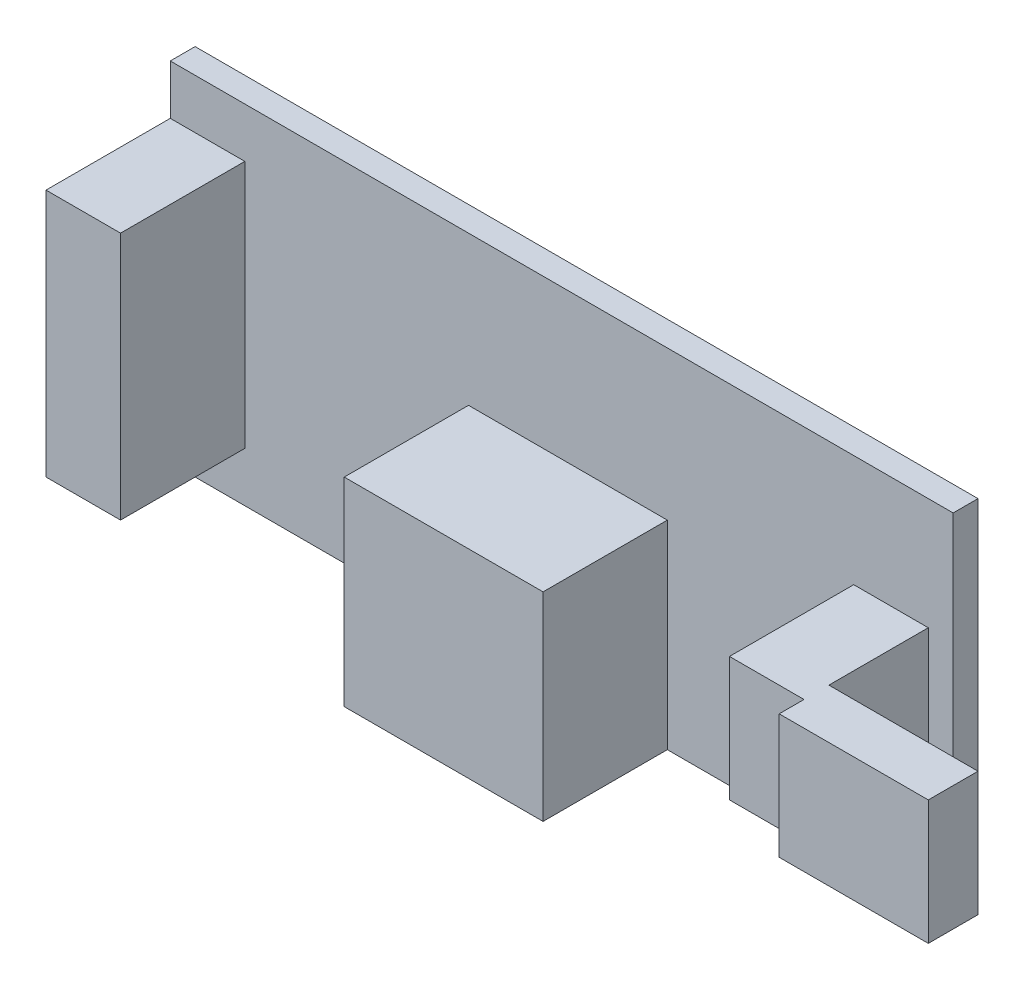
ISO-10303-21;
HEADER;
FILE_DESCRIPTION(('STEP AP214'),'2;1');
FILE_NAME('part.step','',(''),(''),'','','');
FILE_SCHEMA(('AUTOMOTIVE_DESIGN { 1 0 10303 214 1 1 1 1 }'));
ENDSEC;
DATA;
#1=APPLICATION_CONTEXT('core data for automotive mechanical design processes');
#2=APPLICATION_PROTOCOL_DEFINITION('international standard','automotive_design',2000,#1);
#3=PRODUCT_CONTEXT('',#1,'mechanical');
#4=PRODUCT('Part','Part','',(#3));
#5=PRODUCT_RELATED_PRODUCT_CATEGORY('part','',(#4));
#6=PRODUCT_DEFINITION_FORMATION('','',#4);
#7=PRODUCT_DEFINITION_CONTEXT('part definition',#1,'design');
#8=PRODUCT_DEFINITION('design','',#6,#7);
#9=PRODUCT_DEFINITION_SHAPE('','',#8);
#10=(LENGTH_UNIT() NAMED_UNIT(*) SI_UNIT(.MILLI.,.METRE.));
#11=(NAMED_UNIT(*) PLANE_ANGLE_UNIT() SI_UNIT($,.RADIAN.));
#12=(NAMED_UNIT(*) SI_UNIT($,.STERADIAN.) SOLID_ANGLE_UNIT());
#13=UNCERTAINTY_MEASURE_WITH_UNIT(LENGTH_MEASURE(1.E-05),#10,'distance_accuracy_value','');
#14=(GEOMETRIC_REPRESENTATION_CONTEXT(3) GLOBAL_UNCERTAINTY_ASSIGNED_CONTEXT((#13)) GLOBAL_UNIT_ASSIGNED_CONTEXT((#10,
#11,#12)) REPRESENTATION_CONTEXT('',''));
#15=CARTESIAN_POINT('',(0.,0.,0.));
#16=DIRECTION('',(0.,0.,1.));
#17=DIRECTION('',(1.,0.,0.));
#18=AXIS2_PLACEMENT_3D('',#15,#16,#17);
#19=CARTESIAN_POINT('',(11.3241573874395,3.58828005831901,5.));
#20=DIRECTION('',(-1.,0.,0.));
#21=DIRECTION('',(0.,-1.,0.));
#22=AXIS2_PLACEMENT_3D('',#19,#20,#21);
#23=PLANE('',#22);
#24=DIRECTION('',(0.,1.,0.));
#25=VECTOR('',#24,1.);
#26=CARTESIAN_POINT('',(11.3241573874395,3.58828005831901,4.));
#27=LINE('',#26,#25);
#28=CARTESIAN_POINT('',(11.3241573874395,-1.41171994168099,4.));
#29=VERTEX_POINT('',#28);
#30=CARTESIAN_POINT('',(11.3241573874395,3.58828005831901,4.));
#31=VERTEX_POINT('',#30);
#32=EDGE_CURVE('E201',#29,#31,#27,.T.);
#33=ORIENTED_EDGE('',*,*,#32,.F.);
#34=DIRECTION('',(0.,0.,-1.));
#35=VECTOR('',#34,1.);
#36=CARTESIAN_POINT('',(11.3241573874395,-1.41171994168099,5.));
#37=LINE('',#36,#35);
#38=CARTESIAN_POINT('',(11.3241573874395,-1.41171994168099,0.));
#39=VERTEX_POINT('',#38);
#40=EDGE_CURVE('E283',#29,#39,#37,.T.);
#41=ORIENTED_EDGE('',*,*,#40,.T.);
#42=DIRECTION('',(0.,1.,0.));
#43=VECTOR('',#42,1.);
#44=CARTESIAN_POINT('',(11.3241573874395,3.58828005831901,0.));
#45=LINE('',#44,#43);
#46=CARTESIAN_POINT('',(11.3241573874395,3.58828005831901,0.));
#47=VERTEX_POINT('',#46);
#48=EDGE_CURVE('E271',#39,#47,#45,.T.);
#49=ORIENTED_EDGE('',*,*,#48,.T.);
#50=DIRECTION('',(0.,0.,-1.));
#51=VECTOR('',#50,1.);
#52=CARTESIAN_POINT('',(11.3241573874395,3.58828005831901,5.));
#53=LINE('',#52,#51);
#54=EDGE_CURVE('E280',#31,#47,#53,.T.);
#55=ORIENTED_EDGE('',*,*,#54,.F.);
#56=EDGE_LOOP('',(#33,#41,#49,#55));
#57=FACE_BOUND('',#56,.T.);
#58=ADVANCED_FACE('F39',(#57),#23,.F.);
#59=CARTESIAN_POINT('',(0.,0.,0.));
#60=DIRECTION('',(0.,0.,1.));
#61=DIRECTION('',(1.,0.,0.));
#62=AXIS2_PLACEMENT_3D('',#59,#60,#61);
#63=PLANE('',#62);
#64=DIRECTION('',(1.,0.,0.));
#65=VECTOR('',#64,1.);
#66=CARTESIAN_POINT('',(8.32415738743947,-1.41171994168099,0.));
#67=LINE('',#66,#65);
#68=CARTESIAN_POINT('',(8.32415738743947,-1.41171994168099,0.));
#69=VERTEX_POINT('',#68);
#70=EDGE_CURVE('E267',#69,#39,#67,.T.);
#71=ORIENTED_EDGE('',*,*,#70,.F.);
#72=DIRECTION('',(0.,-1.,0.));
#73=VECTOR('',#72,1.);
#74=CARTESIAN_POINT('',(8.32415738743947,3.58828005831901,0.));
#75=LINE('',#74,#73);
#76=CARTESIAN_POINT('',(8.32415738743947,3.58828005831901,0.));
#77=VERTEX_POINT('',#76);
#78=EDGE_CURVE('E246',#77,#69,#75,.T.);
#79=ORIENTED_EDGE('',*,*,#78,.F.);
#80=DIRECTION('',(-1.,0.,0.));
#81=VECTOR('',#80,1.);
#82=CARTESIAN_POINT('',(8.32415738743947,3.58828005831901,0.));
#83=LINE('',#82,#81);
#84=EDGE_CURVE('E252',#47,#77,#83,.T.);
#85=ORIENTED_EDGE('',*,*,#84,.F.);
#86=ORIENTED_EDGE('',*,*,#48,.F.);
#87=EDGE_LOOP('',(#71,#79,#85,#86));
#88=FACE_BOUND('',#87,.T.);
#89=DIRECTION('',(0.,1.,0.));
#90=VECTOR('',#89,1.);
#91=CARTESIAN_POINT('',(-16.1758426125605,6.08828005831901,0.));
#92=LINE('',#91,#90);
#93=CARTESIAN_POINT('',(-16.1758426125605,-3.91171994168099,0.));
#94=VERTEX_POINT('',#93);
#95=CARTESIAN_POINT('',(-16.1758426125605,6.08828005831901,0.));
#96=VERTEX_POINT('',#95);
#97=EDGE_CURVE('E57',#94,#96,#92,.T.);
#98=ORIENTED_EDGE('',*,*,#97,.F.);
#99=DIRECTION('',(1.,0.,0.));
#100=VECTOR('',#99,1.);
#101=CARTESIAN_POINT('',(-19.1758426125605,-3.91171994168099,0.));
#102=LINE('',#101,#100);
#103=CARTESIAN_POINT('',(-19.1758426125605,-3.91171994168099,0.));
#104=VERTEX_POINT('',#103);
#105=EDGE_CURVE('E204',#104,#94,#102,.T.);
#106=ORIENTED_EDGE('',*,*,#105,.F.);
#107=DIRECTION('',(0.,-1.,0.));
#108=VECTOR('',#107,1.);
#109=CARTESIAN_POINT('',(-19.1758426125605,8.08828005831901,0.));
#110=LINE('',#109,#108);
#111=CARTESIAN_POINT('',(-19.1758426125605,-5.91171994168099,0.));
#112=VERTEX_POINT('',#111);
#113=EDGE_CURVE('E330',#104,#112,#110,.T.);
#114=ORIENTED_EDGE('',*,*,#113,.T.);
#115=DIRECTION('',(1.,0.,0.));
#116=VECTOR('',#115,1.);
#117=CARTESIAN_POINT('',(-19.1758426125605,-5.91171994168099,0.));
#118=LINE('',#117,#116);
#119=CARTESIAN_POINT('',(-7.17584261256053,-5.91171994168099,0.));
#120=VERTEX_POINT('',#119);
#121=EDGE_CURVE('E352',#112,#120,#118,.T.);
#122=ORIENTED_EDGE('',*,*,#121,.T.);
#123=DIRECTION('',(0.,-1.,0.));
#124=VECTOR('',#123,1.);
#125=CARTESIAN_POINT('',(-7.17584261256053,2.08828005831901,0.));
#126=LINE('',#125,#124);
#127=CARTESIAN_POINT('',(-7.17584261256053,2.08828005831901,0.));
#128=VERTEX_POINT('',#127);
#129=EDGE_CURVE('E289',#128,#120,#126,.T.);
#130=ORIENTED_EDGE('',*,*,#129,.F.);
#131=DIRECTION('',(-1.,0.,0.));
#132=VECTOR('',#131,1.);
#133=CARTESIAN_POINT('',(-7.17584261256053,2.08828005831901,0.));
#134=LINE('',#133,#132);
#135=CARTESIAN_POINT('',(0.824157387439472,2.08828005831901,0.));
#136=VERTEX_POINT('',#135);
#137=EDGE_CURVE('E295',#136,#128,#134,.T.);
#138=ORIENTED_EDGE('',*,*,#137,.F.);
#139=DIRECTION('',(0.,1.,0.));
#140=VECTOR('',#139,1.);
#141=CARTESIAN_POINT('',(0.824157387439472,2.08828005831901,0.));
#142=LINE('',#141,#140);
#143=CARTESIAN_POINT('',(0.824157387439472,-5.91171994168099,0.));
#144=VERTEX_POINT('',#143);
#145=EDGE_CURVE('E308',#144,#136,#142,.T.);
#146=ORIENTED_EDGE('',*,*,#145,.F.);
#147=CARTESIAN_POINT('',(12.3241573874395,-5.91171994168099,0.));
#148=VERTEX_POINT('',#147);
#149=EDGE_CURVE('E351',#144,#148,#118,.T.);
#150=ORIENTED_EDGE('',*,*,#149,.T.);
#151=DIRECTION('',(0.,1.,0.));
#152=VECTOR('',#151,1.);
#153=CARTESIAN_POINT('',(12.3241573874395,8.08828005831901,0.));
#154=LINE('',#153,#152);
#155=CARTESIAN_POINT('',(12.3241573874395,8.08828005831901,0.));
#156=VERTEX_POINT('',#155);
#157=EDGE_CURVE('E355',#148,#156,#154,.T.);
#158=ORIENTED_EDGE('',*,*,#157,.T.);
#159=DIRECTION('',(-1.,0.,0.));
#160=VECTOR('',#159,1.);
#161=CARTESIAN_POINT('',(-19.1758426125605,8.08828005831901,0.));
#162=LINE('',#161,#160);
#163=CARTESIAN_POINT('',(-19.1758426125605,8.08828005831901,0.));
#164=VERTEX_POINT('',#163);
#165=EDGE_CURVE('E336',#156,#164,#162,.T.);
#166=ORIENTED_EDGE('',*,*,#165,.T.);
#167=CARTESIAN_POINT('',(-19.1758426125605,6.08828005831901,0.));
#168=VERTEX_POINT('',#167);
#169=EDGE_CURVE('E348',#164,#168,#110,.T.);
#170=ORIENTED_EDGE('',*,*,#169,.T.);
#171=DIRECTION('',(-1.,0.,0.));
#172=VECTOR('',#171,1.);
#173=CARTESIAN_POINT('',(-19.1758426125605,6.08828005831901,0.));
#174=LINE('',#173,#172);
#175=EDGE_CURVE('E62',#96,#168,#174,.T.);
#176=ORIENTED_EDGE('',*,*,#175,.F.);
#177=EDGE_LOOP('',(#98,#106,#114,#122,#130,#138,#146,#150,#158,#166,#170,#176));
#178=FACE_BOUND('',#177,.T.);
#179=ADVANCED_FACE('F379',(#88,#178),#63,.T.);
#180=CARTESIAN_POINT('',(-19.1758426125605,8.08828005831901,-1.));
#181=DIRECTION('',(-1.,0.,0.));
#182=DIRECTION('',(0.,0.,1.));
#183=AXIS2_PLACEMENT_3D('',#180,#181,#182);
#184=PLANE('',#183);
#185=ORIENTED_EDGE('',*,*,#169,.F.);
#186=DIRECTION('',(0.,0.,1.));
#187=VECTOR('',#186,1.);
#188=CARTESIAN_POINT('',(-19.1758426125605,8.08828005831901,-1.));
#189=LINE('',#188,#187);
#190=CARTESIAN_POINT('',(-19.1758426125605,8.08828005831901,-1.));
#191=VERTEX_POINT('',#190);
#192=EDGE_CURVE('E11',#191,#164,#189,.T.);
#193=ORIENTED_EDGE('',*,*,#192,.F.);
#194=DIRECTION('',(0.,-1.,0.));
#195=VECTOR('',#194,1.);
#196=CARTESIAN_POINT('',(-19.1758426125605,8.08828005831901,-1.));
#197=LINE('',#196,#195);
#198=CARTESIAN_POINT('',(-19.1758426125605,-5.91171994168099,-1.));
#199=VERTEX_POINT('',#198);
#200=EDGE_CURVE('E331',#191,#199,#197,.T.);
#201=ORIENTED_EDGE('',*,*,#200,.T.);
#202=DIRECTION('',(0.,0.,1.));
#203=VECTOR('',#202,1.);
#204=CARTESIAN_POINT('',(-19.1758426125605,-5.91171994168099,-1.));
#205=LINE('',#204,#203);
#206=EDGE_CURVE('E43',#199,#112,#205,.T.);
#207=ORIENTED_EDGE('',*,*,#206,.T.);
#208=ORIENTED_EDGE('',*,*,#113,.F.);
#209=DIRECTION('',(0.,0.,-1.));
#210=VECTOR('',#209,1.);
#211=CARTESIAN_POINT('',(-19.1758426125605,-3.91171994168099,5.));
#212=LINE('',#211,#210);
#213=CARTESIAN_POINT('',(-19.1758426125605,-3.91171994168099,5.));
#214=VERTEX_POINT('',#213);
#215=EDGE_CURVE('E242',#214,#104,#212,.T.);
#216=ORIENTED_EDGE('',*,*,#215,.F.);
#217=DIRECTION('',(0.,-1.,0.));
#218=VECTOR('',#217,1.);
#219=CARTESIAN_POINT('',(-19.1758426125605,6.08828005831901,5.));
#220=LINE('',#219,#218);
#221=CARTESIAN_POINT('',(-19.1758426125605,6.08828005831901,5.));
#222=VERTEX_POINT('',#221);
#223=EDGE_CURVE('E213',#222,#214,#220,.T.);
#224=ORIENTED_EDGE('',*,*,#223,.F.);
#225=DIRECTION('',(0.,0.,-1.));
#226=VECTOR('',#225,1.);
#227=CARTESIAN_POINT('',(-19.1758426125605,6.08828005831901,5.));
#228=LINE('',#227,#226);
#229=EDGE_CURVE('E225',#222,#168,#228,.T.);
#230=ORIENTED_EDGE('',*,*,#229,.T.);
#231=EDGE_LOOP('',(#185,#193,#201,#207,#208,#216,#224,#230));
#232=FACE_BOUND('',#231,.T.);
#233=ADVANCED_FACE('F41',(#232),#184,.T.);
#234=CARTESIAN_POINT('',(-19.1758426125605,8.08828005831901,-1.));
#235=DIRECTION('',(0.,1.,0.));
#236=DIRECTION('',(0.,0.,1.));
#237=AXIS2_PLACEMENT_3D('',#234,#235,#236);
#238=PLANE('',#237);
#239=ORIENTED_EDGE('',*,*,#165,.F.);
#240=DIRECTION('',(0.,0.,1.));
#241=VECTOR('',#240,1.);
#242=CARTESIAN_POINT('',(12.3241573874395,8.08828005831901,-1.));
#243=LINE('',#242,#241);
#244=CARTESIAN_POINT('',(12.3241573874395,8.08828005831901,-1.));
#245=VERTEX_POINT('',#244);
#246=EDGE_CURVE('E49',#245,#156,#243,.T.);
#247=ORIENTED_EDGE('',*,*,#246,.F.);
#248=DIRECTION('',(-1.,0.,0.));
#249=VECTOR('',#248,1.);
#250=CARTESIAN_POINT('',(-19.1758426125605,8.08828005831901,-1.));
#251=LINE('',#250,#249);
#252=EDGE_CURVE('E344',#245,#191,#251,.T.);
#253=ORIENTED_EDGE('',*,*,#252,.T.);
#254=ORIENTED_EDGE('',*,*,#192,.T.);
#255=EDGE_LOOP('',(#239,#247,#253,#254));
#256=FACE_BOUND('',#255,.T.);
#257=ADVANCED_FACE('F536',(#256),#238,.T.);
#258=CARTESIAN_POINT('',(12.3241573874395,8.08828005831901,-1.));
#259=DIRECTION('',(1.,0.,0.));
#260=DIRECTION('',(0.,0.,-1.));
#261=AXIS2_PLACEMENT_3D('',#258,#259,#260);
#262=PLANE('',#261);
#263=ORIENTED_EDGE('',*,*,#157,.F.);
#264=DIRECTION('',(0.,0.,1.));
#265=VECTOR('',#264,1.);
#266=CARTESIAN_POINT('',(12.3241573874395,-5.91171994168099,-1.));
#267=LINE('',#266,#265);
#268=CARTESIAN_POINT('',(12.3241573874395,-5.91171994168099,-1.));
#269=VERTEX_POINT('',#268);
#270=EDGE_CURVE('E363',#269,#148,#267,.T.);
#271=ORIENTED_EDGE('',*,*,#270,.F.);
#272=DIRECTION('',(0.,1.,0.));
#273=VECTOR('',#272,1.);
#274=CARTESIAN_POINT('',(12.3241573874395,8.08828005831901,-1.));
#275=LINE('',#274,#273);
#276=EDGE_CURVE('E340',#269,#245,#275,.T.);
#277=ORIENTED_EDGE('',*,*,#276,.T.);
#278=ORIENTED_EDGE('',*,*,#246,.T.);
#279=EDGE_LOOP('',(#263,#271,#277,#278));
#280=FACE_BOUND('',#279,.T.);
#281=ADVANCED_FACE('F583',(#280),#262,.T.);
#282=CARTESIAN_POINT('',(-19.1758426125605,-5.91171994168099,-1.));
#283=DIRECTION('',(0.,-1.,0.));
#284=DIRECTION('',(0.,0.,-1.));
#285=AXIS2_PLACEMENT_3D('',#282,#283,#284);
#286=PLANE('',#285);
#287=ORIENTED_EDGE('',*,*,#121,.F.);
#288=ORIENTED_EDGE('',*,*,#206,.F.);
#289=DIRECTION('',(1.,0.,0.));
#290=VECTOR('',#289,1.);
#291=CARTESIAN_POINT('',(-19.1758426125605,-5.91171994168099,-1.));
#292=LINE('',#291,#290);
#293=EDGE_CURVE('E335',#199,#269,#292,.T.);
#294=ORIENTED_EDGE('',*,*,#293,.T.);
#295=ORIENTED_EDGE('',*,*,#270,.T.);
#296=ORIENTED_EDGE('',*,*,#149,.F.);
#297=DIRECTION('',(0.,0.,-1.));
#298=VECTOR('',#297,1.);
#299=CARTESIAN_POINT('',(0.824157387439474,-5.91171994168099,5.));
#300=LINE('',#299,#298);
#301=CARTESIAN_POINT('',(0.824157387439474,-5.91171994168099,5.));
#302=VERTEX_POINT('',#301);
#303=EDGE_CURVE('E322',#302,#144,#300,.T.);
#304=ORIENTED_EDGE('',*,*,#303,.F.);
#305=DIRECTION('',(1.,0.,0.));
#306=VECTOR('',#305,1.);
#307=CARTESIAN_POINT('',(-7.17584261256053,-5.91171994168099,5.));
#308=LINE('',#307,#306);
#309=CARTESIAN_POINT('',(-7.17584261256053,-5.91171994168099,5.));
#310=VERTEX_POINT('',#309);
#311=EDGE_CURVE('E294',#310,#302,#308,.T.);
#312=ORIENTED_EDGE('',*,*,#311,.F.);
#313=DIRECTION('',(0.,0.,-1.));
#314=VECTOR('',#313,1.);
#315=CARTESIAN_POINT('',(-7.17584261256053,-5.91171994168099,5.));
#316=LINE('',#315,#314);
#317=EDGE_CURVE('E326',#310,#120,#316,.T.);
#318=ORIENTED_EDGE('',*,*,#317,.T.);
#319=EDGE_LOOP('',(#287,#288,#294,#295,#296,#304,#312,#318));
#320=FACE_BOUND('',#319,.T.);
#321=ADVANCED_FACE('F377',(#320),#286,.T.);
#322=CARTESIAN_POINT('',(0.,0.,-1.));
#323=DIRECTION('',(0.,0.,1.));
#324=DIRECTION('',(1.,0.,0.));
#325=AXIS2_PLACEMENT_3D('',#322,#323,#324);
#326=PLANE('',#325);
#327=ORIENTED_EDGE('',*,*,#200,.F.);
#328=ORIENTED_EDGE('',*,*,#252,.F.);
#329=ORIENTED_EDGE('',*,*,#276,.F.);
#330=ORIENTED_EDGE('',*,*,#293,.F.);
#331=EDGE_LOOP('',(#327,#328,#329,#330));
#332=FACE_BOUND('',#331,.T.);
#333=ADVANCED_FACE('F573',(#332),#326,.F.);
#334=CARTESIAN_POINT('',(-7.17584261256053,2.08828005831901,5.));
#335=DIRECTION('',(1.,0.,0.));
#336=DIRECTION('',(0.,1.,0.));
#337=AXIS2_PLACEMENT_3D('',#334,#335,#336);
#338=PLANE('',#337);
#339=ORIENTED_EDGE('',*,*,#129,.T.);
#340=ORIENTED_EDGE('',*,*,#317,.F.);
#341=DIRECTION('',(0.,-1.,0.));
#342=VECTOR('',#341,1.);
#343=CARTESIAN_POINT('',(-7.17584261256053,2.08828005831901,5.));
#344=LINE('',#343,#342);
#345=CARTESIAN_POINT('',(-7.17584261256053,2.08828005831901,5.));
#346=VERTEX_POINT('',#345);
#347=EDGE_CURVE('E290',#346,#310,#344,.T.);
#348=ORIENTED_EDGE('',*,*,#347,.F.);
#349=DIRECTION('',(0.,0.,-1.));
#350=VECTOR('',#349,1.);
#351=CARTESIAN_POINT('',(-7.17584261256053,2.08828005831901,5.));
#352=LINE('',#351,#350);
#353=EDGE_CURVE('E304',#346,#128,#352,.T.);
#354=ORIENTED_EDGE('',*,*,#353,.T.);
#355=EDGE_LOOP('',(#339,#340,#348,#354));
#356=FACE_BOUND('',#355,.T.);
#357=ADVANCED_FACE('F394',(#356),#338,.F.);
#358=CARTESIAN_POINT('',(0.824157387439472,2.08828005831901,5.));
#359=DIRECTION('',(-1.,0.,0.));
#360=DIRECTION('',(0.,-1.,0.));
#361=AXIS2_PLACEMENT_3D('',#358,#359,#360);
#362=PLANE('',#361);
#363=ORIENTED_EDGE('',*,*,#145,.T.);
#364=DIRECTION('',(0.,0.,-1.));
#365=VECTOR('',#364,1.);
#366=CARTESIAN_POINT('',(0.824157387439472,2.08828005831901,5.));
#367=LINE('',#366,#365);
#368=CARTESIAN_POINT('',(0.824157387439472,2.08828005831901,5.));
#369=VERTEX_POINT('',#368);
#370=EDGE_CURVE('E318',#369,#136,#367,.T.);
#371=ORIENTED_EDGE('',*,*,#370,.F.);
#372=DIRECTION('',(0.,1.,0.));
#373=VECTOR('',#372,1.);
#374=CARTESIAN_POINT('',(0.824157387439472,2.08828005831901,5.));
#375=LINE('',#374,#373);
#376=EDGE_CURVE('E298',#302,#369,#375,.T.);
#377=ORIENTED_EDGE('',*,*,#376,.F.);
#378=ORIENTED_EDGE('',*,*,#303,.T.);
#379=EDGE_LOOP('',(#363,#371,#377,#378));
#380=FACE_BOUND('',#379,.T.);
#381=ADVANCED_FACE('F386',(#380),#362,.F.);
#382=CARTESIAN_POINT('',(-7.17584261256053,2.08828005831901,5.));
#383=DIRECTION('',(0.,-1.,0.));
#384=DIRECTION('',(0.,0.,-1.));
#385=AXIS2_PLACEMENT_3D('',#382,#383,#384);
#386=PLANE('',#385);
#387=ORIENTED_EDGE('',*,*,#137,.T.);
#388=ORIENTED_EDGE('',*,*,#353,.F.);
#389=DIRECTION('',(-1.,0.,0.));
#390=VECTOR('',#389,1.);
#391=CARTESIAN_POINT('',(-7.17584261256053,2.08828005831901,5.));
#392=LINE('',#391,#390);
#393=EDGE_CURVE('E301',#369,#346,#392,.T.);
#394=ORIENTED_EDGE('',*,*,#393,.F.);
#395=ORIENTED_EDGE('',*,*,#370,.T.);
#396=EDGE_LOOP('',(#387,#388,#394,#395));
#397=FACE_BOUND('',#396,.T.);
#398=ADVANCED_FACE('F396',(#397),#386,.F.);
#399=CARTESIAN_POINT('',(0.,0.,5.));
#400=DIRECTION('',(0.,0.,1.));
#401=DIRECTION('',(1.,0.,0.));
#402=AXIS2_PLACEMENT_3D('',#399,#400,#401);
#403=PLANE('',#402);
#404=ORIENTED_EDGE('',*,*,#347,.T.);
#405=ORIENTED_EDGE('',*,*,#311,.T.);
#406=ORIENTED_EDGE('',*,*,#376,.T.);
#407=ORIENTED_EDGE('',*,*,#393,.T.);
#408=EDGE_LOOP('',(#404,#405,#406,#407));
#409=FACE_BOUND('',#408,.T.);
#410=ADVANCED_FACE('F390',(#409),#403,.T.);
#411=CARTESIAN_POINT('',(8.32415738743947,3.58828005831901,5.));
#412=DIRECTION('',(1.,0.,0.));
#413=DIRECTION('',(0.,0.,-1.));
#414=AXIS2_PLACEMENT_3D('',#411,#412,#413);
#415=PLANE('',#414);
#416=ORIENTED_EDGE('',*,*,#78,.T.);
#417=DIRECTION('',(0.,0.,-1.));
#418=VECTOR('',#417,1.);
#419=CARTESIAN_POINT('',(8.32415738743947,-1.41171994168099,5.));
#420=LINE('',#419,#418);
#421=CARTESIAN_POINT('',(8.32415738743947,-1.41171994168099,5.));
#422=VERTEX_POINT('',#421);
#423=EDGE_CURVE('E286',#422,#69,#420,.T.);
#424=ORIENTED_EDGE('',*,*,#423,.F.);
#425=DIRECTION('',(0.,-1.,0.));
#426=VECTOR('',#425,1.);
#427=CARTESIAN_POINT('',(8.32415738743947,3.58828005831901,5.));
#428=LINE('',#427,#426);
#429=CARTESIAN_POINT('',(8.32415738743947,3.58828005831901,5.));
#430=VERTEX_POINT('',#429);
#431=EDGE_CURVE('E247',#430,#422,#428,.T.);
#432=ORIENTED_EDGE('',*,*,#431,.F.);
#433=DIRECTION('',(0.,0.,-1.));
#434=VECTOR('',#433,1.);
#435=CARTESIAN_POINT('',(8.32415738743947,3.58828005831901,5.));
#436=LINE('',#435,#434);
#437=EDGE_CURVE('E263',#430,#77,#436,.T.);
#438=ORIENTED_EDGE('',*,*,#437,.T.);
#439=EDGE_LOOP('',(#416,#424,#432,#438));
#440=FACE_BOUND('',#439,.T.);
#441=ADVANCED_FACE('F403',(#440),#415,.F.);
#442=CARTESIAN_POINT('',(8.32415738743947,-1.41171994168099,5.));
#443=DIRECTION('',(0.,1.,0.));
#444=DIRECTION('',(-1.,0.,0.));
#445=AXIS2_PLACEMENT_3D('',#442,#443,#444);
#446=PLANE('',#445);
#447=ORIENTED_EDGE('',*,*,#70,.T.);
#448=ORIENTED_EDGE('',*,*,#40,.F.);
#449=DIRECTION('',(-1.,0.,0.));
#450=VECTOR('',#449,1.);
#451=CARTESIAN_POINT('',(17.3241573874395,-1.41171994168099,4.));
#452=LINE('',#451,#450);
#453=CARTESIAN_POINT('',(17.3241573874395,-1.41171994168099,4.));
#454=VERTEX_POINT('',#453);
#455=EDGE_CURVE('E452',#454,#29,#452,.T.);
#456=ORIENTED_EDGE('',*,*,#455,.F.);
#457=DIRECTION('',(0.,0.,-1.));
#458=VECTOR('',#457,1.);
#459=CARTESIAN_POINT('',(17.3241573874395,-1.41171994168099,4.));
#460=LINE('',#459,#458);
#461=CARTESIAN_POINT('',(17.3241573874395,-1.41171994168099,6.));
#462=VERTEX_POINT('',#461);
#463=EDGE_CURVE('E193',#462,#454,#460,.T.);
#464=ORIENTED_EDGE('',*,*,#463,.F.);
#465=DIRECTION('',(-1.,0.,0.));
#466=VECTOR('',#465,1.);
#467=CARTESIAN_POINT('',(17.3241573874395,-1.41171994168099,6.));
#468=LINE('',#467,#466);
#469=CARTESIAN_POINT('',(11.3241573874395,-1.41171994168099,6.));
#470=VERTEX_POINT('',#469);
#471=EDGE_CURVE('E209',#462,#470,#468,.T.);
#472=ORIENTED_EDGE('',*,*,#471,.T.);
#473=DIRECTION('',(0.,0.,-1.));
#474=VECTOR('',#473,1.);
#475=CARTESIAN_POINT('',(11.3241573874395,-1.41171994168099,4.));
#476=LINE('',#475,#474);
#477=CARTESIAN_POINT('',(11.3241573874395,-1.41171994168099,5.));
#478=VERTEX_POINT('',#477);
#479=EDGE_CURVE('E197',#470,#478,#476,.T.);
#480=ORIENTED_EDGE('',*,*,#479,.T.);
#481=DIRECTION('',(1.,0.,0.));
#482=VECTOR('',#481,1.);
#483=CARTESIAN_POINT('',(8.32415738743947,-1.41171994168099,5.));
#484=LINE('',#483,#482);
#485=EDGE_CURVE('E251',#422,#478,#484,.T.);
#486=ORIENTED_EDGE('',*,*,#485,.F.);
#487=ORIENTED_EDGE('',*,*,#423,.T.);
#488=EDGE_LOOP('',(#447,#448,#456,#464,#472,#480,#486,#487));
#489=FACE_BOUND('',#488,.T.);
#490=ADVANCED_FACE('F417',(#489),#446,.F.);
#491=CARTESIAN_POINT('',(8.32415738743947,3.58828005831901,5.));
#492=DIRECTION('',(0.,-1.,0.));
#493=DIRECTION('',(1.,0.,0.));
#494=AXIS2_PLACEMENT_3D('',#491,#492,#493);
#495=PLANE('',#494);
#496=ORIENTED_EDGE('',*,*,#84,.T.);
#497=ORIENTED_EDGE('',*,*,#437,.F.);
#498=DIRECTION('',(-1.,0.,0.));
#499=VECTOR('',#498,1.);
#500=CARTESIAN_POINT('',(8.32415738743947,3.58828005831901,5.));
#501=LINE('',#500,#499);
#502=CARTESIAN_POINT('',(11.3241573874395,3.58828005831901,5.));
#503=VERTEX_POINT('',#502);
#504=EDGE_CURVE('E260',#503,#430,#501,.T.);
#505=ORIENTED_EDGE('',*,*,#504,.F.);
#506=DIRECTION('',(0.,0.,1.));
#507=VECTOR('',#506,1.);
#508=CARTESIAN_POINT('',(11.3241573874395,3.58828005831901,4.));
#509=LINE('',#508,#507);
#510=CARTESIAN_POINT('',(11.3241573874395,3.58828005831901,6.));
#511=VERTEX_POINT('',#510);
#512=EDGE_CURVE('E440',#503,#511,#509,.T.);
#513=ORIENTED_EDGE('',*,*,#512,.T.);
#514=DIRECTION('',(-1.,0.,0.));
#515=VECTOR('',#514,1.);
#516=CARTESIAN_POINT('',(17.3241573874395,3.58828005831901,6.));
#517=LINE('',#516,#515);
#518=CARTESIAN_POINT('',(17.3241573874395,3.58828005831901,6.));
#519=VERTEX_POINT('',#518);
#520=EDGE_CURVE('E183',#519,#511,#517,.T.);
#521=ORIENTED_EDGE('',*,*,#520,.F.);
#522=DIRECTION('',(0.,0.,1.));
#523=VECTOR('',#522,1.);
#524=CARTESIAN_POINT('',(17.3241573874395,3.58828005831901,4.));
#525=LINE('',#524,#523);
#526=CARTESIAN_POINT('',(17.3241573874395,3.58828005831901,4.));
#527=VERTEX_POINT('',#526);
#528=EDGE_CURVE('E176',#527,#519,#525,.T.);
#529=ORIENTED_EDGE('',*,*,#528,.F.);
#530=DIRECTION('',(-1.,0.,0.));
#531=VECTOR('',#530,1.);
#532=CARTESIAN_POINT('',(17.3241573874395,3.58828005831901,4.));
#533=LINE('',#532,#531);
#534=EDGE_CURVE('E180',#527,#31,#533,.T.);
#535=ORIENTED_EDGE('',*,*,#534,.T.);
#536=ORIENTED_EDGE('',*,*,#54,.T.);
#537=EDGE_LOOP('',(#496,#497,#505,#513,#521,#529,#535,#536));
#538=FACE_BOUND('',#537,.T.);
#539=ADVANCED_FACE('F178',(#538),#495,.F.);
#540=CARTESIAN_POINT('',(0.,0.,5.));
#541=DIRECTION('',(0.,0.,1.));
#542=DIRECTION('',(1.,0.,0.));
#543=AXIS2_PLACEMENT_3D('',#540,#541,#542);
#544=PLANE('',#543);
#545=ORIENTED_EDGE('',*,*,#431,.T.);
#546=ORIENTED_EDGE('',*,*,#485,.T.);
#547=DIRECTION('',(0.,1.,0.));
#548=VECTOR('',#547,1.);
#549=CARTESIAN_POINT('',(11.3241573874395,3.58828005831901,5.));
#550=LINE('',#549,#548);
#551=EDGE_CURVE('E256',#478,#503,#550,.T.);
#552=ORIENTED_EDGE('',*,*,#551,.T.);
#553=ORIENTED_EDGE('',*,*,#504,.T.);
#554=EDGE_LOOP('',(#545,#546,#552,#553));
#555=FACE_BOUND('',#554,.T.);
#556=ADVANCED_FACE('F437',(#555),#544,.T.);
#557=CARTESIAN_POINT('',(-19.1758426125605,-3.91171994168099,5.));
#558=DIRECTION('',(0.,1.,0.));
#559=DIRECTION('',(0.,0.,1.));
#560=AXIS2_PLACEMENT_3D('',#557,#558,#559);
#561=PLANE('',#560);
#562=ORIENTED_EDGE('',*,*,#105,.T.);
#563=DIRECTION('',(0.,0.,-1.));
#564=VECTOR('',#563,1.);
#565=CARTESIAN_POINT('',(-16.1758426125605,-3.91171994168099,5.));
#566=LINE('',#565,#564);
#567=CARTESIAN_POINT('',(-16.1758426125605,-3.91171994168099,5.));
#568=VERTEX_POINT('',#567);
#569=EDGE_CURVE('E238',#568,#94,#566,.T.);
#570=ORIENTED_EDGE('',*,*,#569,.F.);
#571=DIRECTION('',(1.,0.,0.));
#572=VECTOR('',#571,1.);
#573=CARTESIAN_POINT('',(-19.1758426125605,-3.91171994168099,5.));
#574=LINE('',#573,#572);
#575=EDGE_CURVE('E217',#214,#568,#574,.T.);
#576=ORIENTED_EDGE('',*,*,#575,.F.);
#577=ORIENTED_EDGE('',*,*,#215,.T.);
#578=EDGE_LOOP('',(#562,#570,#576,#577));
#579=FACE_BOUND('',#578,.T.);
#580=ADVANCED_FACE('F484',(#579),#561,.F.);
#581=CARTESIAN_POINT('',(-16.1758426125605,6.08828005831901,5.));
#582=DIRECTION('',(-1.,0.,0.));
#583=DIRECTION('',(0.,0.,1.));
#584=AXIS2_PLACEMENT_3D('',#581,#582,#583);
#585=PLANE('',#584);
#586=ORIENTED_EDGE('',*,*,#97,.T.);
#587=DIRECTION('',(0.,0.,-1.));
#588=VECTOR('',#587,1.);
#589=CARTESIAN_POINT('',(-16.1758426125605,6.08828005831901,5.));
#590=LINE('',#589,#588);
#591=CARTESIAN_POINT('',(-16.1758426125605,6.08828005831901,5.));
#592=VERTEX_POINT('',#591);
#593=EDGE_CURVE('E234',#592,#96,#590,.T.);
#594=ORIENTED_EDGE('',*,*,#593,.F.);
#595=DIRECTION('',(0.,1.,0.));
#596=VECTOR('',#595,1.);
#597=CARTESIAN_POINT('',(-16.1758426125605,6.08828005831901,5.));
#598=LINE('',#597,#596);
#599=EDGE_CURVE('E220',#568,#592,#598,.T.);
#600=ORIENTED_EDGE('',*,*,#599,.F.);
#601=ORIENTED_EDGE('',*,*,#569,.T.);
#602=EDGE_LOOP('',(#586,#594,#600,#601));
#603=FACE_BOUND('',#602,.T.);
#604=ADVANCED_FACE('F480',(#603),#585,.F.);
#605=CARTESIAN_POINT('',(-19.1758426125605,6.08828005831901,5.));
#606=DIRECTION('',(0.,-1.,0.));
#607=DIRECTION('',(0.,0.,-1.));
#608=AXIS2_PLACEMENT_3D('',#605,#606,#607);
#609=PLANE('',#608);
#610=ORIENTED_EDGE('',*,*,#175,.T.);
#611=ORIENTED_EDGE('',*,*,#229,.F.);
#612=DIRECTION('',(-1.,0.,0.));
#613=VECTOR('',#612,1.);
#614=CARTESIAN_POINT('',(-19.1758426125605,6.08828005831901,5.));
#615=LINE('',#614,#613);
#616=EDGE_CURVE('E223',#592,#222,#615,.T.);
#617=ORIENTED_EDGE('',*,*,#616,.F.);
#618=ORIENTED_EDGE('',*,*,#593,.T.);
#619=EDGE_LOOP('',(#610,#611,#617,#618));
#620=FACE_BOUND('',#619,.T.);
#621=ADVANCED_FACE('F476',(#620),#609,.F.);
#622=CARTESIAN_POINT('',(0.,0.,5.));
#623=DIRECTION('',(0.,0.,1.));
#624=DIRECTION('',(1.,0.,0.));
#625=AXIS2_PLACEMENT_3D('',#622,#623,#624);
#626=PLANE('',#625);
#627=ORIENTED_EDGE('',*,*,#223,.T.);
#628=ORIENTED_EDGE('',*,*,#575,.T.);
#629=ORIENTED_EDGE('',*,*,#599,.T.);
#630=ORIENTED_EDGE('',*,*,#616,.T.);
#631=EDGE_LOOP('',(#627,#628,#629,#630));
#632=FACE_BOUND('',#631,.T.);
#633=ADVANCED_FACE('F470',(#632),#626,.T.);
#634=CARTESIAN_POINT('',(17.3241573874395,3.58828005831901,4.));
#635=DIRECTION('',(0.,0.,1.));
#636=DIRECTION('',(0.,-1.,0.));
#637=AXIS2_PLACEMENT_3D('',#634,#635,#636);
#638=PLANE('',#637);
#639=ORIENTED_EDGE('',*,*,#32,.T.);
#640=ORIENTED_EDGE('',*,*,#534,.F.);
#641=DIRECTION('',(0.,1.,0.));
#642=VECTOR('',#641,1.);
#643=CARTESIAN_POINT('',(17.3241573874395,3.58828005831901,4.));
#644=LINE('',#643,#642);
#645=EDGE_CURVE('E188',#454,#527,#644,.T.);
#646=ORIENTED_EDGE('',*,*,#645,.F.);
#647=ORIENTED_EDGE('',*,*,#455,.T.);
#648=EDGE_LOOP('',(#639,#640,#646,#647));
#649=FACE_BOUND('',#648,.T.);
#650=ADVANCED_FACE('F199',(#649),#638,.F.);
#651=CARTESIAN_POINT('',(17.3241573874395,3.58828005831901,6.));
#652=DIRECTION('',(0.,0.,-1.));
#653=DIRECTION('',(0.,1.,0.));
#654=AXIS2_PLACEMENT_3D('',#651,#652,#653);
#655=PLANE('',#654);
#656=DIRECTION('',(0.,-1.,0.));
#657=VECTOR('',#656,1.);
#658=CARTESIAN_POINT('',(11.3241573874395,3.58828005831901,6.));
#659=LINE('',#658,#657);
#660=EDGE_CURVE('E443',#511,#470,#659,.T.);
#661=ORIENTED_EDGE('',*,*,#660,.T.);
#662=ORIENTED_EDGE('',*,*,#471,.F.);
#663=DIRECTION('',(0.,-1.,0.));
#664=VECTOR('',#663,1.);
#665=CARTESIAN_POINT('',(17.3241573874395,3.58828005831901,6.));
#666=LINE('',#665,#664);
#667=EDGE_CURVE('E187',#519,#462,#666,.T.);
#668=ORIENTED_EDGE('',*,*,#667,.F.);
#669=ORIENTED_EDGE('',*,*,#520,.T.);
#670=EDGE_LOOP('',(#661,#662,#668,#669));
#671=FACE_BOUND('',#670,.T.);
#672=ADVANCED_FACE('F460',(#671),#655,.F.);
#673=CARTESIAN_POINT('',(17.3241573874395,0.,0.));
#674=DIRECTION('',(-1.,0.,0.));
#675=DIRECTION('',(0.,-1.,0.));
#676=AXIS2_PLACEMENT_3D('',#673,#674,#675);
#677=PLANE('',#676);
#678=ORIENTED_EDGE('',*,*,#645,.T.);
#679=ORIENTED_EDGE('',*,*,#528,.T.);
#680=ORIENTED_EDGE('',*,*,#667,.T.);
#681=ORIENTED_EDGE('',*,*,#463,.T.);
#682=EDGE_LOOP('',(#678,#679,#680,#681));
#683=FACE_BOUND('',#682,.T.);
#684=ADVANCED_FACE('F191',(#683),#677,.F.);
#685=CARTESIAN_POINT('',(11.3241573874395,0.,0.));
#686=DIRECTION('',(-1.,0.,0.));
#687=DIRECTION('',(0.,-1.,0.));
#688=AXIS2_PLACEMENT_3D('',#685,#686,#687);
#689=PLANE('',#688);
#690=ORIENTED_EDGE('',*,*,#512,.F.);
#691=ORIENTED_EDGE('',*,*,#551,.F.);
#692=ORIENTED_EDGE('',*,*,#479,.F.);
#693=ORIENTED_EDGE('',*,*,#660,.F.);
#694=EDGE_LOOP('',(#690,#691,#692,#693));
#695=FACE_BOUND('',#694,.T.);
#696=ADVANCED_FACE('F459',(#695),#689,.T.);
#697=CLOSED_SHELL('',(#58,#179,#233,#257,#281,#321,#333,#357,#381,#398,#410,#441,#490,#539,#556,
#580,#604,#621,#633,#650,#672,#684,#696));
#698=MANIFOLD_SOLID_BREP('B2',#697);
#699=ADVANCED_BREP_SHAPE_REPRESENTATION('',(#18,#698),#14);
#700=SHAPE_DEFINITION_REPRESENTATION(#9,#699);
ENDSEC;
END-ISO-10303-21;
